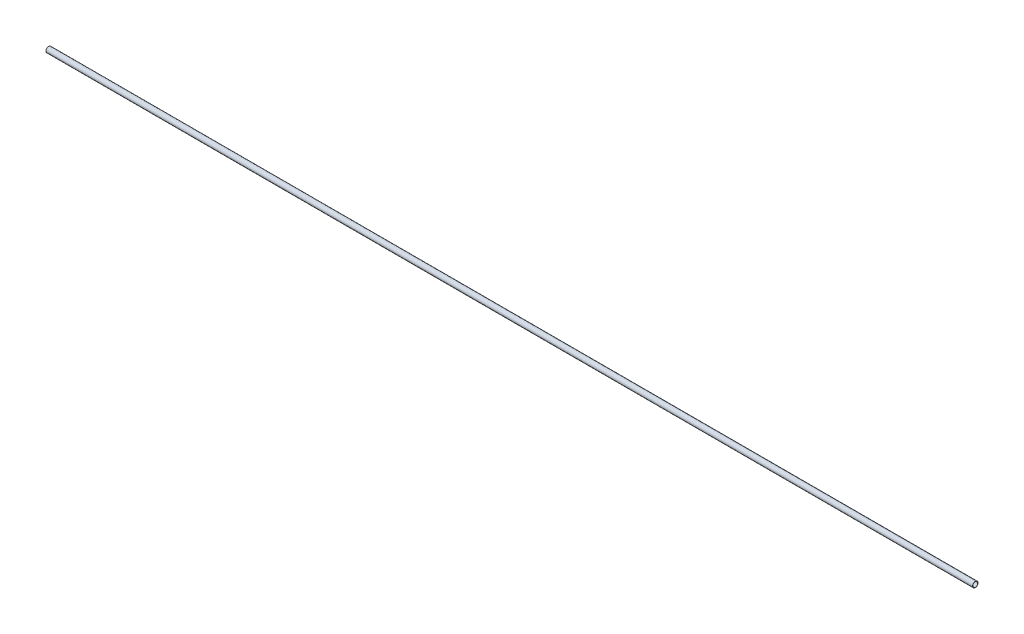
ISO-10303-21;
HEADER;
FILE_DESCRIPTION(('STEP AP214'),'2;1');
FILE_NAME('part.step','',(''),(''),'','','');
FILE_SCHEMA(('AUTOMOTIVE_DESIGN { 1 0 10303 214 1 1 1 1 }'));
ENDSEC;
DATA;
#1=APPLICATION_CONTEXT('core data for automotive mechanical design processes');
#2=APPLICATION_PROTOCOL_DEFINITION('international standard','automotive_design',2000,#1);
#3=PRODUCT_CONTEXT('',#1,'mechanical');
#4=PRODUCT('Part','Part','',(#3));
#5=PRODUCT_RELATED_PRODUCT_CATEGORY('part','',(#4));
#6=PRODUCT_DEFINITION_FORMATION('','',#4);
#7=PRODUCT_DEFINITION_CONTEXT('part definition',#1,'design');
#8=PRODUCT_DEFINITION('design','',#6,#7);
#9=PRODUCT_DEFINITION_SHAPE('','',#8);
#10=(LENGTH_UNIT() NAMED_UNIT(*) SI_UNIT(.MILLI.,.METRE.));
#11=(NAMED_UNIT(*) PLANE_ANGLE_UNIT() SI_UNIT($,.RADIAN.));
#12=(NAMED_UNIT(*) SI_UNIT($,.STERADIAN.) SOLID_ANGLE_UNIT());
#13=UNCERTAINTY_MEASURE_WITH_UNIT(LENGTH_MEASURE(1.E-05),#10,'distance_accuracy_value','');
#14=(GEOMETRIC_REPRESENTATION_CONTEXT(3) GLOBAL_UNCERTAINTY_ASSIGNED_CONTEXT((#13)) GLOBAL_UNIT_ASSIGNED_CONTEXT((#10,
#11,#12)) REPRESENTATION_CONTEXT('',''));
#15=CARTESIAN_POINT('',(0.,0.,0.));
#16=DIRECTION('',(0.,0.,1.));
#17=DIRECTION('',(1.,0.,0.));
#18=AXIS2_PLACEMENT_3D('',#15,#16,#17);
#19=CARTESIAN_POINT('',(3048.,0.,0.));
#20=DIRECTION('',(1.,0.,0.));
#21=DIRECTION('',(0.,0.,-1.));
#22=AXIS2_PLACEMENT_3D('',#19,#20,#21);
#23=PLANE('',#22);
#24=CARTESIAN_POINT('',(3048.,0.,0.));
#25=DIRECTION('',(1.,0.,0.));
#26=DIRECTION('',(0.,0.,-1.));
#27=AXIS2_PLACEMENT_3D('',#24,#25,#26);
#28=CIRCLE('',#27,8.9662);
#29=CARTESIAN_POINT('',(3048.,0.,-8.9662));
#30=VERTEX_POINT('',#29);
#31=EDGE_CURVE('E10',#30,#30,#28,.T.);
#32=ORIENTED_EDGE('',*,*,#31,.T.);
#33=EDGE_LOOP('',(#32));
#34=FACE_BOUND('',#33,.T.);
#35=CARTESIAN_POINT('',(3048.,0.,0.));
#36=DIRECTION('',(1.,0.,0.));
#37=DIRECTION('',(0.,0.,-1.));
#38=AXIS2_PLACEMENT_3D('',#35,#36,#37);
#39=CIRCLE('',#38,7.8994);
#40=CARTESIAN_POINT('',(3048.,0.,-7.8994));
#41=VERTEX_POINT('',#40);
#42=EDGE_CURVE('E41',#41,#41,#39,.T.);
#43=ORIENTED_EDGE('',*,*,#42,.F.);
#44=EDGE_LOOP('',(#43));
#45=FACE_BOUND('',#44,.T.);
#46=ADVANCED_FACE('F30',(#34,#45),#23,.T.);
#47=CARTESIAN_POINT('',(0.,0.,0.));
#48=DIRECTION('',(1.,0.,0.));
#49=DIRECTION('',(0.,0.,-1.));
#50=AXIS2_PLACEMENT_3D('',#47,#48,#49);
#51=PLANE('',#50);
#52=CARTESIAN_POINT('',(0.,0.,0.));
#53=DIRECTION('',(1.,0.,0.));
#54=DIRECTION('',(0.,0.,-1.));
#55=AXIS2_PLACEMENT_3D('',#52,#53,#54);
#56=CIRCLE('',#55,8.9662);
#57=CARTESIAN_POINT('',(0.,0.,-8.9662));
#58=VERTEX_POINT('',#57);
#59=EDGE_CURVE('E34',#58,#58,#56,.T.);
#60=ORIENTED_EDGE('',*,*,#59,.F.);
#61=EDGE_LOOP('',(#60));
#62=FACE_BOUND('',#61,.T.);
#63=CARTESIAN_POINT('',(0.,0.,0.));
#64=DIRECTION('',(1.,0.,0.));
#65=DIRECTION('',(0.,0.,-1.));
#66=AXIS2_PLACEMENT_3D('',#63,#64,#65);
#67=CIRCLE('',#66,7.8994);
#68=CARTESIAN_POINT('',(0.,0.,-7.8994));
#69=VERTEX_POINT('',#68);
#70=EDGE_CURVE('E43',#69,#69,#67,.T.);
#71=ORIENTED_EDGE('',*,*,#70,.T.);
#72=EDGE_LOOP('',(#71));
#73=FACE_BOUND('',#72,.T.);
#74=ADVANCED_FACE('F53',(#62,#73),#51,.F.);
#75=CARTESIAN_POINT('',(3048.,0.,0.));
#76=DIRECTION('',(-1.,0.,0.));
#77=DIRECTION('',(0.,0.,1.));
#78=AXIS2_PLACEMENT_3D('',#75,#76,#77);
#79=CYLINDRICAL_SURFACE('',#78,8.9662);
#80=ORIENTED_EDGE('',*,*,#31,.F.);
#81=EDGE_LOOP('',(#80));
#82=FACE_BOUND('',#81,.T.);
#83=ORIENTED_EDGE('',*,*,#59,.T.);
#84=EDGE_LOOP('',(#83));
#85=FACE_BOUND('',#84,.T.);
#86=ADVANCED_FACE('F32',(#82,#85),#79,.T.);
#87=CARTESIAN_POINT('',(3048.,0.,0.));
#88=DIRECTION('',(-1.,0.,0.));
#89=DIRECTION('',(0.,0.,1.));
#90=AXIS2_PLACEMENT_3D('',#87,#88,#89);
#91=CYLINDRICAL_SURFACE('',#90,7.8994);
#92=ORIENTED_EDGE('',*,*,#42,.T.);
#93=EDGE_LOOP('',(#92));
#94=FACE_BOUND('',#93,.T.);
#95=ORIENTED_EDGE('',*,*,#70,.F.);
#96=EDGE_LOOP('',(#95));
#97=FACE_BOUND('',#96,.T.);
#98=ADVANCED_FACE('F49',(#94,#97),#91,.F.);
#99=CLOSED_SHELL('',(#46,#74,#86,#98));
#100=MANIFOLD_SOLID_BREP('B2',#99);
#101=ADVANCED_BREP_SHAPE_REPRESENTATION('',(#18,#100),#14);
#102=SHAPE_DEFINITION_REPRESENTATION(#9,#101);
ENDSEC;
END-ISO-10303-21;
